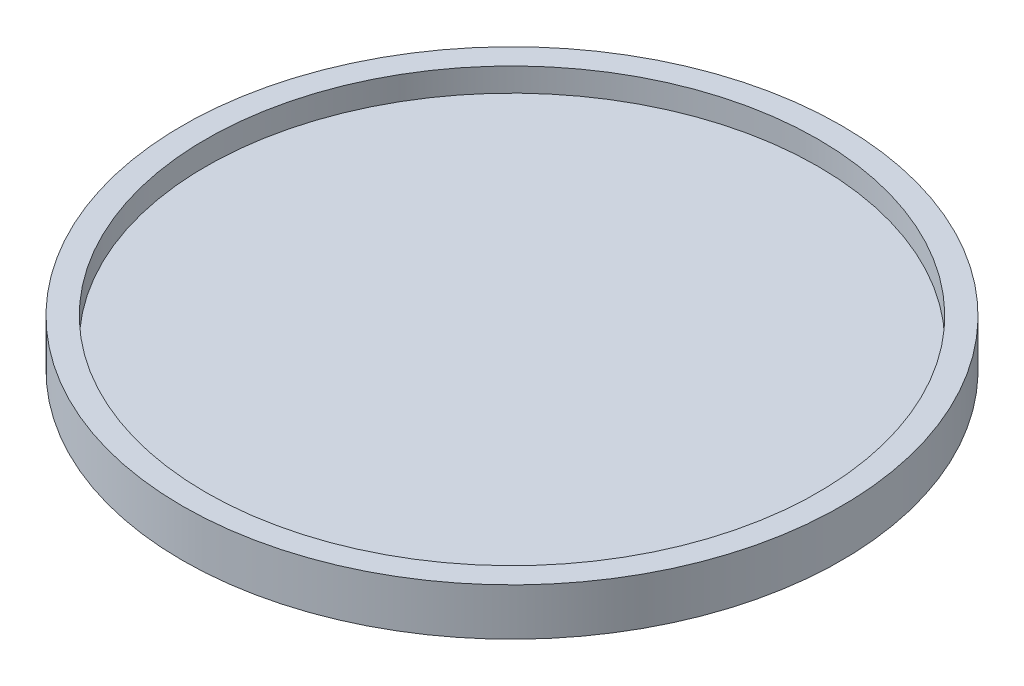
ISO-10303-21;
HEADER;
FILE_DESCRIPTION(('STEP AP214'),'2;1');
FILE_NAME('part.step','',(''),(''),'','','');
FILE_SCHEMA(('AUTOMOTIVE_DESIGN { 1 0 10303 214 1 1 1 1 }'));
ENDSEC;
DATA;
#1=APPLICATION_CONTEXT('core data for automotive mechanical design processes');
#2=APPLICATION_PROTOCOL_DEFINITION('international standard','automotive_design',2000,#1);
#3=PRODUCT_CONTEXT('',#1,'mechanical');
#4=PRODUCT('Part','Part','',(#3));
#5=PRODUCT_RELATED_PRODUCT_CATEGORY('part','',(#4));
#6=PRODUCT_DEFINITION_FORMATION('','',#4);
#7=PRODUCT_DEFINITION_CONTEXT('part definition',#1,'design');
#8=PRODUCT_DEFINITION('design','',#6,#7);
#9=PRODUCT_DEFINITION_SHAPE('','',#8);
#10=(LENGTH_UNIT() NAMED_UNIT(*) SI_UNIT(.MILLI.,.METRE.));
#11=(NAMED_UNIT(*) PLANE_ANGLE_UNIT() SI_UNIT($,.RADIAN.));
#12=(NAMED_UNIT(*) SI_UNIT($,.STERADIAN.) SOLID_ANGLE_UNIT());
#13=UNCERTAINTY_MEASURE_WITH_UNIT(LENGTH_MEASURE(1.E-05),#10,'distance_accuracy_value','');
#14=(GEOMETRIC_REPRESENTATION_CONTEXT(3) GLOBAL_UNCERTAINTY_ASSIGNED_CONTEXT((#13)) GLOBAL_UNIT_ASSIGNED_CONTEXT((#10,
#11,#12)) REPRESENTATION_CONTEXT('',''));
#15=CARTESIAN_POINT('',(0.,0.,0.));
#16=DIRECTION('',(0.,0.,1.));
#17=DIRECTION('',(1.,0.,0.));
#18=AXIS2_PLACEMENT_3D('',#15,#16,#17);
#19=CARTESIAN_POINT('',(0.,-10.,0.));
#20=DIRECTION('',(0.,1.,0.));
#21=DIRECTION('',(0.,0.,1.));
#22=AXIS2_PLACEMENT_3D('',#19,#20,#21);
#23=CYLINDRICAL_SURFACE('',#22,140.);
#24=CARTESIAN_POINT('',(0.,-10.,0.));
#25=DIRECTION('',(0.,1.,0.));
#26=DIRECTION('',(0.,0.,1.));
#27=AXIS2_PLACEMENT_3D('',#24,#25,#26);
#28=CIRCLE('',#27,140.);
#29=CARTESIAN_POINT('',(0.,-10.,140.));
#30=VERTEX_POINT('',#29);
#31=EDGE_CURVE('E10',#30,#30,#28,.T.);
#32=ORIENTED_EDGE('',*,*,#31,.T.);
#33=EDGE_LOOP('',(#32));
#34=FACE_BOUND('',#33,.T.);
#35=CARTESIAN_POINT('',(0.,10.,0.));
#36=DIRECTION('',(0.,1.,0.));
#37=DIRECTION('',(0.,0.,1.));
#38=AXIS2_PLACEMENT_3D('',#35,#36,#37);
#39=CIRCLE('',#38,140.);
#40=CARTESIAN_POINT('',(0.,10.,140.));
#41=VERTEX_POINT('',#40);
#42=EDGE_CURVE('E47',#41,#41,#39,.T.);
#43=ORIENTED_EDGE('',*,*,#42,.F.);
#44=EDGE_LOOP('',(#43));
#45=FACE_BOUND('',#44,.T.);
#46=ADVANCED_FACE('F41',(#34,#45),#23,.T.);
#47=CARTESIAN_POINT('',(0.,-10.,0.));
#48=DIRECTION('',(0.,1.,0.));
#49=DIRECTION('',(0.,0.,1.));
#50=AXIS2_PLACEMENT_3D('',#47,#48,#49);
#51=PLANE('',#50);
#52=ORIENTED_EDGE('',*,*,#31,.F.);
#53=EDGE_LOOP('',(#52));
#54=FACE_BOUND('',#53,.T.);
#55=ADVANCED_FACE('F73',(#54),#51,.F.);
#56=CARTESIAN_POINT('',(0.,10.,0.));
#57=DIRECTION('',(0.,1.,0.));
#58=DIRECTION('',(0.,0.,1.));
#59=AXIS2_PLACEMENT_3D('',#56,#57,#58);
#60=PLANE('',#59);
#61=ORIENTED_EDGE('',*,*,#42,.T.);
#62=EDGE_LOOP('',(#61));
#63=FACE_BOUND('',#62,.T.);
#64=CARTESIAN_POINT('',(0.,10.,0.));
#65=DIRECTION('',(0.,1.,0.));
#66=DIRECTION('',(0.,0.,1.));
#67=AXIS2_PLACEMENT_3D('',#64,#65,#66);
#68=CIRCLE('',#67,130.);
#69=CARTESIAN_POINT('',(0.,10.,130.));
#70=VERTEX_POINT('',#69);
#71=EDGE_CURVE('E51',#70,#70,#68,.T.);
#72=ORIENTED_EDGE('',*,*,#71,.F.);
#73=EDGE_LOOP('',(#72));
#74=FACE_BOUND('',#73,.T.);
#75=ADVANCED_FACE('F65',(#63,#74),#60,.T.);
#76=CARTESIAN_POINT('',(0.,10.,0.));
#77=DIRECTION('',(0.,-1.,0.));
#78=DIRECTION('',(0.,0.,-1.));
#79=AXIS2_PLACEMENT_3D('',#76,#77,#78);
#80=CYLINDRICAL_SURFACE('',#79,130.);
#81=ORIENTED_EDGE('',*,*,#71,.T.);
#82=EDGE_LOOP('',(#81));
#83=FACE_BOUND('',#82,.T.);
#84=CARTESIAN_POINT('',(0.,0.,0.));
#85=DIRECTION('',(0.,1.,0.));
#86=DIRECTION('',(0.,0.,1.));
#87=AXIS2_PLACEMENT_3D('',#84,#85,#86);
#88=CIRCLE('',#87,130.);
#89=CARTESIAN_POINT('',(0.,0.,130.));
#90=VERTEX_POINT('',#89);
#91=EDGE_CURVE('E55',#90,#90,#88,.T.);
#92=ORIENTED_EDGE('',*,*,#91,.F.);
#93=EDGE_LOOP('',(#92));
#94=FACE_BOUND('',#93,.T.);
#95=ADVANCED_FACE('F63',(#83,#94),#80,.F.);
#96=CARTESIAN_POINT('',(0.,0.,0.));
#97=DIRECTION('',(0.,1.,0.));
#98=DIRECTION('',(0.,0.,1.));
#99=AXIS2_PLACEMENT_3D('',#96,#97,#98);
#100=PLANE('',#99);
#101=ORIENTED_EDGE('',*,*,#91,.T.);
#102=EDGE_LOOP('',(#101));
#103=FACE_BOUND('',#102,.T.);
#104=ADVANCED_FACE('F61',(#103),#100,.T.);
#105=CLOSED_SHELL('',(#46,#55,#75,#95,#104));
#106=MANIFOLD_SOLID_BREP('B2',#105);
#107=ADVANCED_BREP_SHAPE_REPRESENTATION('',(#18,#106),#14);
#108=SHAPE_DEFINITION_REPRESENTATION(#9,#107);
ENDSEC;
END-ISO-10303-21;
